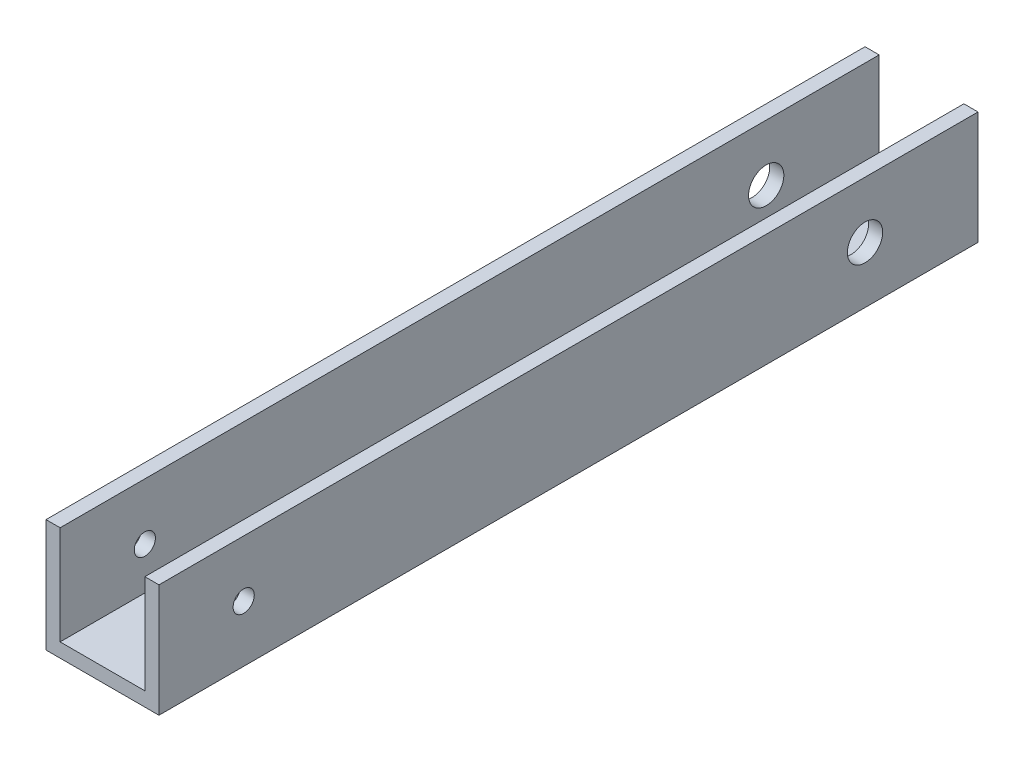
ISO-10303-21;
HEADER;
FILE_DESCRIPTION(('STEP AP214'),'2;1');
FILE_NAME('part.step','',(''),(''),'','','');
FILE_SCHEMA(('AUTOMOTIVE_DESIGN { 1 0 10303 214 1 1 1 1 }'));
ENDSEC;
DATA;
#1=APPLICATION_CONTEXT('core data for automotive mechanical design processes');
#2=APPLICATION_PROTOCOL_DEFINITION('international standard','automotive_design',2000,#1);
#3=PRODUCT_CONTEXT('',#1,'mechanical');
#4=PRODUCT('Part','Part','',(#3));
#5=PRODUCT_RELATED_PRODUCT_CATEGORY('part','',(#4));
#6=PRODUCT_DEFINITION_FORMATION('','',#4);
#7=PRODUCT_DEFINITION_CONTEXT('part definition',#1,'design');
#8=PRODUCT_DEFINITION('design','',#6,#7);
#9=PRODUCT_DEFINITION_SHAPE('','',#8);
#10=(LENGTH_UNIT() NAMED_UNIT(*) SI_UNIT(.MILLI.,.METRE.));
#11=(NAMED_UNIT(*) PLANE_ANGLE_UNIT() SI_UNIT($,.RADIAN.));
#12=(NAMED_UNIT(*) SI_UNIT($,.STERADIAN.) SOLID_ANGLE_UNIT());
#13=UNCERTAINTY_MEASURE_WITH_UNIT(LENGTH_MEASURE(1.E-05),#10,'distance_accuracy_value','');
#14=(GEOMETRIC_REPRESENTATION_CONTEXT(3) GLOBAL_UNCERTAINTY_ASSIGNED_CONTEXT((#13)) GLOBAL_UNIT_ASSIGNED_CONTEXT((#10,
#11,#12)) REPRESENTATION_CONTEXT('',''));
#15=CARTESIAN_POINT('',(0.,0.,0.));
#16=DIRECTION('',(0.,0.,1.));
#17=DIRECTION('',(1.,0.,0.));
#18=AXIS2_PLACEMENT_3D('',#15,#16,#17);
#19=CARTESIAN_POINT('',(0.,25.4,184.15));
#20=DIRECTION('',(1.,0.,0.));
#21=DIRECTION('',(0.,1.,0.));
#22=AXIS2_PLACEMENT_3D('',#19,#20,#21);
#23=PLANE('',#22);
#24=CARTESIAN_POINT('',(0.,12.7,25.4));
#25=DIRECTION('',(1.,0.,0.));
#26=DIRECTION('',(0.,0.,-1.));
#27=AXIS2_PLACEMENT_3D('',#24,#25,#26);
#28=CIRCLE('',#27,3.96875);
#29=CARTESIAN_POINT('',(0.,12.7,21.43125));
#30=VERTEX_POINT('',#29);
#31=EDGE_CURVE('E217',#30,#30,#28,.T.);
#32=ORIENTED_EDGE('',*,*,#31,.T.);
#33=EDGE_LOOP('',(#32));
#34=FACE_BOUND('',#33,.T.);
#35=CARTESIAN_POINT('',(0.,12.7,165.1));
#36=DIRECTION('',(1.,0.,0.));
#37=DIRECTION('',(0.,0.,-1.));
#38=AXIS2_PLACEMENT_3D('',#35,#36,#37);
#39=CIRCLE('',#38,2.38125000000001);
#40=CARTESIAN_POINT('',(0.,12.7,162.71875));
#41=VERTEX_POINT('',#40);
#42=EDGE_CURVE('E159',#41,#41,#39,.T.);
#43=ORIENTED_EDGE('',*,*,#42,.T.);
#44=EDGE_LOOP('',(#43));
#45=FACE_BOUND('',#44,.T.);
#46=DIRECTION('',(0.,-1.,0.));
#47=VECTOR('',#46,1.);
#48=CARTESIAN_POINT('',(0.,25.4,0.));
#49=LINE('',#48,#47);
#50=CARTESIAN_POINT('',(0.,25.4,0.));
#51=VERTEX_POINT('',#50);
#52=CARTESIAN_POINT('',(0.,0.,0.));
#53=VERTEX_POINT('',#52);
#54=EDGE_CURVE('E131',#51,#53,#49,.T.);
#55=ORIENTED_EDGE('',*,*,#54,.T.);
#56=DIRECTION('',(0.,0.,-1.));
#57=VECTOR('',#56,1.);
#58=CARTESIAN_POINT('',(0.,0.,184.15));
#59=LINE('',#58,#57);
#60=CARTESIAN_POINT('',(0.,0.,184.15));
#61=VERTEX_POINT('',#60);
#62=EDGE_CURVE('E11',#61,#53,#59,.T.);
#63=ORIENTED_EDGE('',*,*,#62,.F.);
#64=DIRECTION('',(0.,-1.,0.));
#65=VECTOR('',#64,1.);
#66=CARTESIAN_POINT('',(0.,25.4,184.15));
#67=LINE('',#66,#65);
#68=CARTESIAN_POINT('',(0.,25.4,184.15));
#69=VERTEX_POINT('',#68);
#70=EDGE_CURVE('E146',#69,#61,#67,.T.);
#71=ORIENTED_EDGE('',*,*,#70,.F.);
#72=DIRECTION('',(0.,0.,-1.));
#73=VECTOR('',#72,1.);
#74=CARTESIAN_POINT('',(0.,25.4,184.15));
#75=LINE('',#74,#73);
#76=EDGE_CURVE('E127',#69,#51,#75,.T.);
#77=ORIENTED_EDGE('',*,*,#76,.T.);
#78=EDGE_LOOP('',(#55,#63,#71,#77));
#79=FACE_BOUND('',#78,.T.);
#80=ADVANCED_FACE('F33',(#34,#45,#79),#23,.F.);
#81=CARTESIAN_POINT('',(0.,0.,184.15));
#82=DIRECTION('',(0.,1.,0.));
#83=DIRECTION('',(0.,0.,1.));
#84=AXIS2_PLACEMENT_3D('',#81,#82,#83);
#85=PLANE('',#84);
#86=DIRECTION('',(1.,0.,0.));
#87=VECTOR('',#86,1.);
#88=CARTESIAN_POINT('',(0.,0.,0.));
#89=LINE('',#88,#87);
#90=CARTESIAN_POINT('',(25.4,0.,0.));
#91=VERTEX_POINT('',#90);
#92=EDGE_CURVE('E134',#53,#91,#89,.T.);
#93=ORIENTED_EDGE('',*,*,#92,.T.);
#94=DIRECTION('',(0.,0.,-1.));
#95=VECTOR('',#94,1.);
#96=CARTESIAN_POINT('',(25.4,0.,184.15));
#97=LINE('',#96,#95);
#98=CARTESIAN_POINT('',(25.4,0.,184.15));
#99=VERTEX_POINT('',#98);
#100=EDGE_CURVE('E42',#99,#91,#97,.T.);
#101=ORIENTED_EDGE('',*,*,#100,.F.);
#102=DIRECTION('',(1.,0.,0.));
#103=VECTOR('',#102,1.);
#104=CARTESIAN_POINT('',(0.,0.,184.15));
#105=LINE('',#104,#103);
#106=EDGE_CURVE('E94',#61,#99,#105,.T.);
#107=ORIENTED_EDGE('',*,*,#106,.F.);
#108=ORIENTED_EDGE('',*,*,#62,.T.);
#109=EDGE_LOOP('',(#93,#101,#107,#108));
#110=FACE_BOUND('',#109,.T.);
#111=ADVANCED_FACE('F209',(#110),#85,.F.);
#112=CARTESIAN_POINT('',(25.4,0.,184.15));
#113=DIRECTION('',(-1.,0.,0.));
#114=DIRECTION('',(0.,0.,1.));
#115=AXIS2_PLACEMENT_3D('',#112,#113,#114);
#116=PLANE('',#115);
#117=CARTESIAN_POINT('',(25.4,12.7,25.4));
#118=DIRECTION('',(1.,0.,0.));
#119=DIRECTION('',(0.,0.,-1.));
#120=AXIS2_PLACEMENT_3D('',#117,#118,#119);
#121=CIRCLE('',#120,3.96875);
#122=CARTESIAN_POINT('',(25.4,12.7,21.43125));
#123=VERTEX_POINT('',#122);
#124=EDGE_CURVE('E219',#123,#123,#121,.T.);
#125=ORIENTED_EDGE('',*,*,#124,.F.);
#126=EDGE_LOOP('',(#125));
#127=FACE_BOUND('',#126,.T.);
#128=CARTESIAN_POINT('',(25.4,12.7,165.1));
#129=DIRECTION('',(1.,0.,0.));
#130=DIRECTION('',(0.,0.,-1.));
#131=AXIS2_PLACEMENT_3D('',#128,#129,#130);
#132=CIRCLE('',#131,2.38125000000001);
#133=CARTESIAN_POINT('',(25.4,12.7,162.71875));
#134=VERTEX_POINT('',#133);
#135=EDGE_CURVE('E165',#134,#134,#132,.T.);
#136=ORIENTED_EDGE('',*,*,#135,.F.);
#137=EDGE_LOOP('',(#136));
#138=FACE_BOUND('',#137,.T.);
#139=DIRECTION('',(0.,1.,0.));
#140=VECTOR('',#139,1.);
#141=CARTESIAN_POINT('',(25.4,0.,0.));
#142=LINE('',#141,#140);
#143=CARTESIAN_POINT('',(25.4,25.4,0.));
#144=VERTEX_POINT('',#143);
#145=EDGE_CURVE('E137',#91,#144,#142,.T.);
#146=ORIENTED_EDGE('',*,*,#145,.T.);
#147=DIRECTION('',(0.,0.,-1.));
#148=VECTOR('',#147,1.);
#149=CARTESIAN_POINT('',(25.4,25.4,184.15));
#150=LINE('',#149,#148);
#151=CARTESIAN_POINT('',(25.4,25.4,184.15));
#152=VERTEX_POINT('',#151);
#153=EDGE_CURVE('E153',#152,#144,#150,.T.);
#154=ORIENTED_EDGE('',*,*,#153,.F.);
#155=DIRECTION('',(0.,1.,0.));
#156=VECTOR('',#155,1.);
#157=CARTESIAN_POINT('',(25.4,0.,184.15));
#158=LINE('',#157,#156);
#159=EDGE_CURVE('E177',#99,#152,#158,.T.);
#160=ORIENTED_EDGE('',*,*,#159,.F.);
#161=ORIENTED_EDGE('',*,*,#100,.T.);
#162=EDGE_LOOP('',(#146,#154,#160,#161));
#163=FACE_BOUND('',#162,.T.);
#164=ADVANCED_FACE('F214',(#127,#138,#163),#116,.F.);
#165=CARTESIAN_POINT('',(25.4,25.4,184.15));
#166=DIRECTION('',(0.,-1.,0.));
#167=DIRECTION('',(0.,0.,-1.));
#168=AXIS2_PLACEMENT_3D('',#165,#166,#167);
#169=PLANE('',#168);
#170=DIRECTION('',(-1.,0.,0.));
#171=VECTOR('',#170,1.);
#172=CARTESIAN_POINT('',(25.4,25.4,0.));
#173=LINE('',#172,#171);
#174=CARTESIAN_POINT('',(22.225,25.4,0.));
#175=VERTEX_POINT('',#174);
#176=EDGE_CURVE('E139',#144,#175,#173,.T.);
#177=ORIENTED_EDGE('',*,*,#176,.T.);
#178=DIRECTION('',(0.,0.,-1.));
#179=VECTOR('',#178,1.);
#180=CARTESIAN_POINT('',(22.225,25.4,184.15));
#181=LINE('',#180,#179);
#182=CARTESIAN_POINT('',(22.225,25.4,184.15));
#183=VERTEX_POINT('',#182);
#184=EDGE_CURVE('E150',#183,#175,#181,.T.);
#185=ORIENTED_EDGE('',*,*,#184,.F.);
#186=DIRECTION('',(-1.,0.,0.));
#187=VECTOR('',#186,1.);
#188=CARTESIAN_POINT('',(25.4,25.4,184.15));
#189=LINE('',#188,#187);
#190=EDGE_CURVE('E179',#152,#183,#189,.T.);
#191=ORIENTED_EDGE('',*,*,#190,.F.);
#192=ORIENTED_EDGE('',*,*,#153,.T.);
#193=EDGE_LOOP('',(#177,#185,#191,#192));
#194=FACE_BOUND('',#193,.T.);
#195=ADVANCED_FACE('F185',(#194),#169,.F.);
#196=CARTESIAN_POINT('',(22.225,25.4,184.15));
#197=DIRECTION('',(1.,0.,0.));
#198=DIRECTION('',(0.,1.,0.));
#199=AXIS2_PLACEMENT_3D('',#196,#197,#198);
#200=PLANE('',#199);
#201=CARTESIAN_POINT('',(22.225,12.7,25.4));
#202=DIRECTION('',(1.,0.,0.));
#203=DIRECTION('',(0.,1.,0.));
#204=AXIS2_PLACEMENT_3D('',#201,#202,#203);
#205=CIRCLE('',#204,3.96875);
#206=CARTESIAN_POINT('',(22.225,16.66875,25.4));
#207=VERTEX_POINT('',#206);
#208=EDGE_CURVE('E170',#207,#207,#205,.T.);
#209=ORIENTED_EDGE('',*,*,#208,.T.);
#210=EDGE_LOOP('',(#209));
#211=FACE_BOUND('',#210,.T.);
#212=CARTESIAN_POINT('',(22.225,12.7,165.1));
#213=DIRECTION('',(1.,0.,0.));
#214=DIRECTION('',(0.,1.,0.));
#215=AXIS2_PLACEMENT_3D('',#212,#213,#214);
#216=CIRCLE('',#215,2.38125000000001);
#217=CARTESIAN_POINT('',(22.225,15.08125,165.1));
#218=VERTEX_POINT('',#217);
#219=EDGE_CURVE('E135',#218,#218,#216,.T.);
#220=ORIENTED_EDGE('',*,*,#219,.T.);
#221=EDGE_LOOP('',(#220));
#222=FACE_BOUND('',#221,.T.);
#223=DIRECTION('',(0.,-1.,0.));
#224=VECTOR('',#223,1.);
#225=CARTESIAN_POINT('',(22.225,25.4,0.));
#226=LINE('',#225,#224);
#227=CARTESIAN_POINT('',(22.225,3.175,0.));
#228=VERTEX_POINT('',#227);
#229=EDGE_CURVE('E141',#175,#228,#226,.T.);
#230=ORIENTED_EDGE('',*,*,#229,.T.);
#231=DIRECTION('',(0.,0.,-1.));
#232=VECTOR('',#231,1.);
#233=CARTESIAN_POINT('',(22.225,3.175,184.15));
#234=LINE('',#233,#232);
#235=CARTESIAN_POINT('',(22.225,3.175,184.15));
#236=VERTEX_POINT('',#235);
#237=EDGE_CURVE('E122',#236,#228,#234,.T.);
#238=ORIENTED_EDGE('',*,*,#237,.F.);
#239=DIRECTION('',(0.,-1.,0.));
#240=VECTOR('',#239,1.);
#241=CARTESIAN_POINT('',(22.225,25.4,184.15));
#242=LINE('',#241,#240);
#243=EDGE_CURVE('E113',#183,#236,#242,.T.);
#244=ORIENTED_EDGE('',*,*,#243,.F.);
#245=ORIENTED_EDGE('',*,*,#184,.T.);
#246=EDGE_LOOP('',(#230,#238,#244,#245));
#247=FACE_BOUND('',#246,.T.);
#248=ADVANCED_FACE('F189',(#211,#222,#247),#200,.F.);
#249=CARTESIAN_POINT('',(22.225,3.175,184.15));
#250=DIRECTION('',(0.,-1.,0.));
#251=DIRECTION('',(1.,0.,0.));
#252=AXIS2_PLACEMENT_3D('',#249,#250,#251);
#253=PLANE('',#252);
#254=DIRECTION('',(-1.,0.,0.));
#255=VECTOR('',#254,1.);
#256=CARTESIAN_POINT('',(22.225,3.175,0.));
#257=LINE('',#256,#255);
#258=CARTESIAN_POINT('',(3.175,3.175,0.));
#259=VERTEX_POINT('',#258);
#260=EDGE_CURVE('E121',#228,#259,#257,.T.);
#261=ORIENTED_EDGE('',*,*,#260,.T.);
#262=DIRECTION('',(0.,0.,-1.));
#263=VECTOR('',#262,1.);
#264=CARTESIAN_POINT('',(3.175,3.175,184.15));
#265=LINE('',#264,#263);
#266=CARTESIAN_POINT('',(3.175,3.175,184.15));
#267=VERTEX_POINT('',#266);
#268=EDGE_CURVE('E118',#267,#259,#265,.T.);
#269=ORIENTED_EDGE('',*,*,#268,.F.);
#270=DIRECTION('',(-1.,0.,0.));
#271=VECTOR('',#270,1.);
#272=CARTESIAN_POINT('',(22.225,3.175,184.15));
#273=LINE('',#272,#271);
#274=EDGE_CURVE('E107',#236,#267,#273,.T.);
#275=ORIENTED_EDGE('',*,*,#274,.F.);
#276=ORIENTED_EDGE('',*,*,#237,.T.);
#277=EDGE_LOOP('',(#261,#269,#275,#276));
#278=FACE_BOUND('',#277,.T.);
#279=ADVANCED_FACE('F119',(#278),#253,.F.);
#280=CARTESIAN_POINT('',(3.175,3.175,184.15));
#281=DIRECTION('',(-1.,0.,0.));
#282=DIRECTION('',(0.,-1.,0.));
#283=AXIS2_PLACEMENT_3D('',#280,#281,#282);
#284=PLANE('',#283);
#285=CARTESIAN_POINT('',(3.175,12.7,25.4));
#286=DIRECTION('',(-1.,0.,0.));
#287=DIRECTION('',(0.,-1.,0.));
#288=AXIS2_PLACEMENT_3D('',#285,#286,#287);
#289=CIRCLE('',#288,3.96875);
#290=CARTESIAN_POINT('',(3.175,8.73125,25.4));
#291=VERTEX_POINT('',#290);
#292=EDGE_CURVE('E36',#291,#291,#289,.T.);
#293=ORIENTED_EDGE('',*,*,#292,.T.);
#294=EDGE_LOOP('',(#293));
#295=FACE_BOUND('',#294,.T.);
#296=CARTESIAN_POINT('',(3.175,12.7,165.1));
#297=DIRECTION('',(-1.,0.,0.));
#298=DIRECTION('',(0.,-1.,0.));
#299=AXIS2_PLACEMENT_3D('',#296,#297,#298);
#300=CIRCLE('',#299,2.38125000000001);
#301=CARTESIAN_POINT('',(3.175,10.31875,165.1));
#302=VERTEX_POINT('',#301);
#303=EDGE_CURVE('E157',#302,#302,#300,.T.);
#304=ORIENTED_EDGE('',*,*,#303,.T.);
#305=EDGE_LOOP('',(#304));
#306=FACE_BOUND('',#305,.T.);
#307=DIRECTION('',(0.,1.,0.));
#308=VECTOR('',#307,1.);
#309=CARTESIAN_POINT('',(3.175,3.175,0.));
#310=LINE('',#309,#308);
#311=CARTESIAN_POINT('',(3.175,25.4,0.));
#312=VERTEX_POINT('',#311);
#313=EDGE_CURVE('E80',#259,#312,#310,.T.);
#314=ORIENTED_EDGE('',*,*,#313,.T.);
#315=DIRECTION('',(0.,0.,-1.));
#316=VECTOR('',#315,1.);
#317=CARTESIAN_POINT('',(3.175,25.4,184.15));
#318=LINE('',#317,#316);
#319=CARTESIAN_POINT('',(3.175,25.4,184.15));
#320=VERTEX_POINT('',#319);
#321=EDGE_CURVE('E123',#320,#312,#318,.T.);
#322=ORIENTED_EDGE('',*,*,#321,.F.);
#323=DIRECTION('',(0.,1.,0.));
#324=VECTOR('',#323,1.);
#325=CARTESIAN_POINT('',(3.175,3.175,184.15));
#326=LINE('',#325,#324);
#327=EDGE_CURVE('E111',#267,#320,#326,.T.);
#328=ORIENTED_EDGE('',*,*,#327,.F.);
#329=ORIENTED_EDGE('',*,*,#268,.T.);
#330=EDGE_LOOP('',(#314,#322,#328,#329));
#331=FACE_BOUND('',#330,.T.);
#332=ADVANCED_FACE('F125',(#295,#306,#331),#284,.F.);
#333=CARTESIAN_POINT('',(3.175,25.4,184.15));
#334=DIRECTION('',(0.,-1.,0.));
#335=DIRECTION('',(0.,0.,-1.));
#336=AXIS2_PLACEMENT_3D('',#333,#334,#335);
#337=PLANE('',#336);
#338=DIRECTION('',(-1.,0.,0.));
#339=VECTOR('',#338,1.);
#340=CARTESIAN_POINT('',(3.175,25.4,0.));
#341=LINE('',#340,#339);
#342=EDGE_CURVE('E86',#312,#51,#341,.T.);
#343=ORIENTED_EDGE('',*,*,#342,.T.);
#344=ORIENTED_EDGE('',*,*,#76,.F.);
#345=DIRECTION('',(-1.,0.,0.));
#346=VECTOR('',#345,1.);
#347=CARTESIAN_POINT('',(3.175,25.4,184.15));
#348=LINE('',#347,#346);
#349=EDGE_CURVE('E51',#320,#69,#348,.T.);
#350=ORIENTED_EDGE('',*,*,#349,.F.);
#351=ORIENTED_EDGE('',*,*,#321,.T.);
#352=EDGE_LOOP('',(#343,#344,#350,#351));
#353=FACE_BOUND('',#352,.T.);
#354=ADVANCED_FACE('F197',(#353),#337,.F.);
#355=CARTESIAN_POINT('',(0.,0.,184.15));
#356=DIRECTION('',(0.,0.,1.));
#357=DIRECTION('',(1.,0.,0.));
#358=AXIS2_PLACEMENT_3D('',#355,#356,#357);
#359=PLANE('',#358);
#360=ORIENTED_EDGE('',*,*,#70,.T.);
#361=ORIENTED_EDGE('',*,*,#106,.T.);
#362=ORIENTED_EDGE('',*,*,#159,.T.);
#363=ORIENTED_EDGE('',*,*,#190,.T.);
#364=ORIENTED_EDGE('',*,*,#243,.T.);
#365=ORIENTED_EDGE('',*,*,#274,.T.);
#366=ORIENTED_EDGE('',*,*,#327,.T.);
#367=ORIENTED_EDGE('',*,*,#349,.T.);
#368=EDGE_LOOP('',(#360,#361,#362,#363,#364,#365,#366,#367));
#369=FACE_BOUND('',#368,.T.);
#370=ADVANCED_FACE('F109',(#369),#359,.T.);
#371=CARTESIAN_POINT('',(0.,0.,0.));
#372=DIRECTION('',(0.,0.,1.));
#373=DIRECTION('',(1.,0.,0.));
#374=AXIS2_PLACEMENT_3D('',#371,#372,#373);
#375=PLANE('',#374);
#376=ORIENTED_EDGE('',*,*,#54,.F.);
#377=ORIENTED_EDGE('',*,*,#342,.F.);
#378=ORIENTED_EDGE('',*,*,#313,.F.);
#379=ORIENTED_EDGE('',*,*,#260,.F.);
#380=ORIENTED_EDGE('',*,*,#229,.F.);
#381=ORIENTED_EDGE('',*,*,#176,.F.);
#382=ORIENTED_EDGE('',*,*,#145,.F.);
#383=ORIENTED_EDGE('',*,*,#92,.F.);
#384=EDGE_LOOP('',(#376,#377,#378,#379,#380,#381,#382,#383));
#385=FACE_BOUND('',#384,.T.);
#386=ADVANCED_FACE('F192',(#385),#375,.F.);
#387=CARTESIAN_POINT('',(0.,12.7,165.1));
#388=DIRECTION('',(1.,0.,0.));
#389=DIRECTION('',(0.,0.,-1.));
#390=AXIS2_PLACEMENT_3D('',#387,#388,#389);
#391=CYLINDRICAL_SURFACE('',#390,2.38125000000001);
#392=ORIENTED_EDGE('',*,*,#42,.F.);
#393=EDGE_LOOP('',(#392));
#394=FACE_BOUND('',#393,.T.);
#395=ORIENTED_EDGE('',*,*,#303,.F.);
#396=EDGE_LOOP('',(#395));
#397=FACE_BOUND('',#396,.T.);
#398=ADVANCED_FACE('F238',(#394,#397),#391,.F.);
#399=ORIENTED_EDGE('',*,*,#135,.T.);
#400=EDGE_LOOP('',(#399));
#401=FACE_BOUND('',#400,.T.);
#402=ORIENTED_EDGE('',*,*,#219,.F.);
#403=EDGE_LOOP('',(#402));
#404=FACE_BOUND('',#403,.T.);
#405=ADVANCED_FACE('F234',(#401,#404),#391,.F.);
#406=CARTESIAN_POINT('',(0.,12.7,25.4));
#407=DIRECTION('',(1.,0.,0.));
#408=DIRECTION('',(0.,0.,-1.));
#409=AXIS2_PLACEMENT_3D('',#406,#407,#408);
#410=CYLINDRICAL_SURFACE('',#409,3.96875);
#411=ORIENTED_EDGE('',*,*,#31,.F.);
#412=EDGE_LOOP('',(#411));
#413=FACE_BOUND('',#412,.T.);
#414=ORIENTED_EDGE('',*,*,#292,.F.);
#415=EDGE_LOOP('',(#414));
#416=FACE_BOUND('',#415,.T.);
#417=ADVANCED_FACE('F237',(#413,#416),#410,.F.);
#418=ORIENTED_EDGE('',*,*,#124,.T.);
#419=EDGE_LOOP('',(#418));
#420=FACE_BOUND('',#419,.T.);
#421=ORIENTED_EDGE('',*,*,#208,.F.);
#422=EDGE_LOOP('',(#421));
#423=FACE_BOUND('',#422,.T.);
#424=ADVANCED_FACE('F225',(#420,#423),#410,.F.);
#425=CLOSED_SHELL('',(#80,#111,#164,#195,#248,#279,#332,#354,#370,#386,#398,#405,#417,#424));
#426=MANIFOLD_SOLID_BREP('B2',#425);
#427=ADVANCED_BREP_SHAPE_REPRESENTATION('',(#18,#426),#14);
#428=SHAPE_DEFINITION_REPRESENTATION(#9,#427);
ENDSEC;
END-ISO-10303-21;
